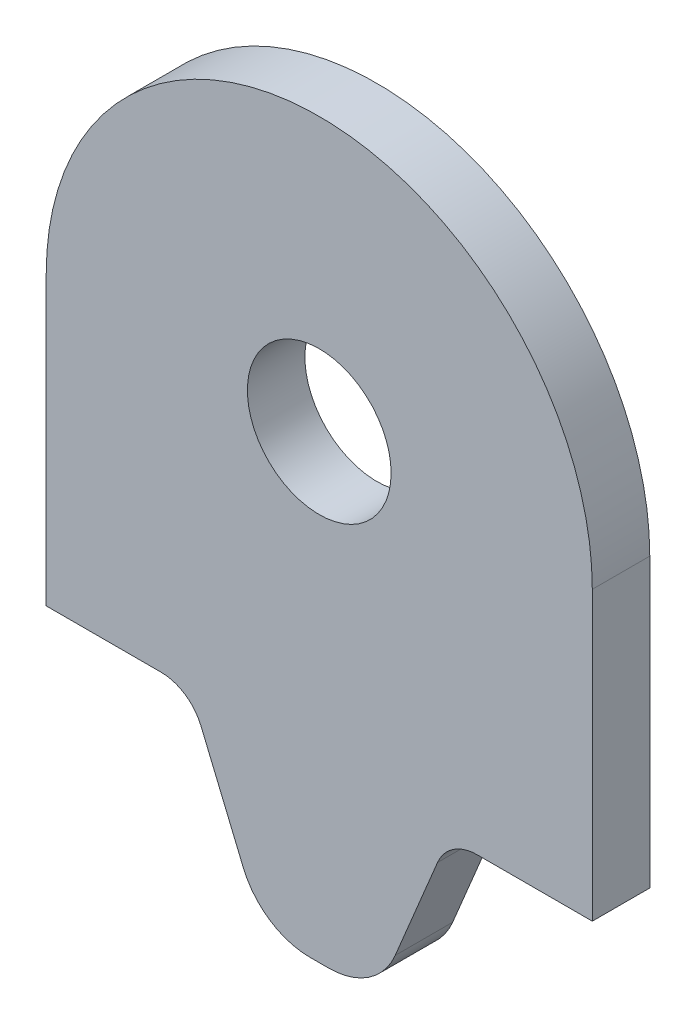
ISO-10303-21;
HEADER;
FILE_DESCRIPTION(('STEP AP214'),'2;1');
FILE_NAME('part.step','',(''),(''),'','','');
FILE_SCHEMA(('AUTOMOTIVE_DESIGN { 1 0 10303 214 1 1 1 1 }'));
ENDSEC;
DATA;
#1=APPLICATION_CONTEXT('core data for automotive mechanical design processes');
#2=APPLICATION_PROTOCOL_DEFINITION('international standard','automotive_design',2000,#1);
#3=PRODUCT_CONTEXT('',#1,'mechanical');
#4=PRODUCT('Part','Part','',(#3));
#5=PRODUCT_RELATED_PRODUCT_CATEGORY('part','',(#4));
#6=PRODUCT_DEFINITION_FORMATION('','',#4);
#7=PRODUCT_DEFINITION_CONTEXT('part definition',#1,'design');
#8=PRODUCT_DEFINITION('design','',#6,#7);
#9=PRODUCT_DEFINITION_SHAPE('','',#8);
#10=(LENGTH_UNIT() NAMED_UNIT(*) SI_UNIT(.MILLI.,.METRE.));
#11=(NAMED_UNIT(*) PLANE_ANGLE_UNIT() SI_UNIT($,.RADIAN.));
#12=(NAMED_UNIT(*) SI_UNIT($,.STERADIAN.) SOLID_ANGLE_UNIT());
#13=UNCERTAINTY_MEASURE_WITH_UNIT(LENGTH_MEASURE(1.E-05),#10,'distance_accuracy_value','');
#14=(GEOMETRIC_REPRESENTATION_CONTEXT(3) GLOBAL_UNCERTAINTY_ASSIGNED_CONTEXT((#13)) GLOBAL_UNIT_ASSIGNED_CONTEXT((#10,
#11,#12)) REPRESENTATION_CONTEXT('',''));
#15=CARTESIAN_POINT('',(0.,0.,0.));
#16=DIRECTION('',(0.,0.,1.));
#17=DIRECTION('',(1.,0.,0.));
#18=AXIS2_PLACEMENT_3D('',#15,#16,#17);
#19=CARTESIAN_POINT('',(0.,0.,4.));
#20=DIRECTION('',(0.,0.,1.));
#21=DIRECTION('',(1.,0.,0.));
#22=AXIS2_PLACEMENT_3D('',#19,#20,#21);
#23=PLANE('',#22);
#24=DIRECTION('',(-0.384615384615385,0.923076923076923,0.));
#25=VECTOR('',#24,1.);
#26=CARTESIAN_POINT('',(-9.,-20.,4.));
#27=LINE('',#26,#25);
#28=CARTESIAN_POINT('',(-5.28205128205128,-28.9230769230769,4.));
#29=VERTEX_POINT('',#28);
#30=CARTESIAN_POINT('',(-8.23076923076923,-21.8461538461538,4.));
#31=VERTEX_POINT('',#30);
#32=EDGE_CURVE('E226',#29,#31,#27,.T.);
#33=ORIENTED_EDGE('',*,*,#32,.F.);
#34=CARTESIAN_POINT('',(-0.666666666666667,-27.,4.));
#35=DIRECTION('',(0.,0.,1.));
#36=DIRECTION('',(1.,0.,0.));
#37=AXIS2_PLACEMENT_3D('',#34,#35,#36);
#38=CIRCLE('',#37,5.);
#39=CARTESIAN_POINT('',(-0.666666666666667,-32.,4.));
#40=VERTEX_POINT('',#39);
#41=EDGE_CURVE('E168',#29,#40,#38,.T.);
#42=ORIENTED_EDGE('',*,*,#41,.T.);
#43=DIRECTION('',(-1.,0.,0.));
#44=VECTOR('',#43,1.);
#45=CARTESIAN_POINT('',(-4.,-32.,4.));
#46=LINE('',#45,#44);
#47=CARTESIAN_POINT('',(0.666666666666685,-32.,4.));
#48=VERTEX_POINT('',#47);
#49=EDGE_CURVE('E220',#48,#40,#46,.T.);
#50=ORIENTED_EDGE('',*,*,#49,.F.);
#51=CARTESIAN_POINT('',(0.666666666666685,-27.,4.));
#52=DIRECTION('',(0.,0.,1.));
#53=DIRECTION('',(1.,0.,0.));
#54=AXIS2_PLACEMENT_3D('',#51,#52,#53);
#55=CIRCLE('',#54,5.);
#56=CARTESIAN_POINT('',(5.2820512820513,-28.9230769230769,4.));
#57=VERTEX_POINT('',#56);
#58=EDGE_CURVE('E165',#48,#57,#55,.T.);
#59=ORIENTED_EDGE('',*,*,#58,.T.);
#60=DIRECTION('',(-0.384615384615384,-0.923076923076923,0.));
#61=VECTOR('',#60,1.);
#62=CARTESIAN_POINT('',(4.00000000000002,-32.,4.));
#63=LINE('',#62,#61);
#64=CARTESIAN_POINT('',(8.23076923076925,-21.8461538461538,4.));
#65=VERTEX_POINT('',#64);
#66=EDGE_CURVE('E215',#65,#57,#63,.T.);
#67=ORIENTED_EDGE('',*,*,#66,.F.);
#68=CARTESIAN_POINT('',(11.,-23.,4.));
#69=DIRECTION('',(0.,0.,1.));
#70=DIRECTION('',(1.,0.,0.));
#71=AXIS2_PLACEMENT_3D('',#68,#69,#70);
#72=CIRCLE('',#71,3.);
#73=CARTESIAN_POINT('',(11.,-20.,4.));
#74=VERTEX_POINT('',#73);
#75=EDGE_CURVE('E190',#65,#74,#72,.F.);
#76=ORIENTED_EDGE('',*,*,#75,.T.);
#77=DIRECTION('',(-1.,0.,0.));
#78=VECTOR('',#77,1.);
#79=CARTESIAN_POINT('',(9.00000000000002,-20.,4.));
#80=LINE('',#79,#78);
#81=CARTESIAN_POINT('',(19.,-20.,4.));
#82=VERTEX_POINT('',#81);
#83=EDGE_CURVE('E213',#82,#74,#80,.T.);
#84=ORIENTED_EDGE('',*,*,#83,.F.);
#85=DIRECTION('',(0.,1.,0.));
#86=VECTOR('',#85,1.);
#87=CARTESIAN_POINT('',(19.,-45.,4.));
#88=LINE('',#87,#86);
#89=CARTESIAN_POINT('',(19.,0.,4.));
#90=VERTEX_POINT('',#89);
#91=EDGE_CURVE('E160',#82,#90,#88,.T.);
#92=ORIENTED_EDGE('',*,*,#91,.T.);
#93=CARTESIAN_POINT('',(0.,0.,4.));
#94=DIRECTION('',(0.,0.,1.));
#95=DIRECTION('',(1.,0.,0.));
#96=AXIS2_PLACEMENT_3D('',#93,#94,#95);
#97=CIRCLE('',#96,19.);
#98=CARTESIAN_POINT('',(-19.,0.,4.));
#99=VERTEX_POINT('',#98);
#100=EDGE_CURVE('E151',#90,#99,#97,.T.);
#101=ORIENTED_EDGE('',*,*,#100,.T.);
#102=DIRECTION('',(0.,-1.,0.));
#103=VECTOR('',#102,1.);
#104=CARTESIAN_POINT('',(-19.,0.,4.));
#105=LINE('',#104,#103);
#106=CARTESIAN_POINT('',(-19.,-20.,4.));
#107=VERTEX_POINT('',#106);
#108=EDGE_CURVE('E236',#99,#107,#105,.T.);
#109=ORIENTED_EDGE('',*,*,#108,.T.);
#110=DIRECTION('',(-1.,0.,0.));
#111=VECTOR('',#110,1.);
#112=CARTESIAN_POINT('',(-19.,-20.,4.));
#113=LINE('',#112,#111);
#114=CARTESIAN_POINT('',(-11.,-20.,4.));
#115=VERTEX_POINT('',#114);
#116=EDGE_CURVE('E139',#115,#107,#113,.T.);
#117=ORIENTED_EDGE('',*,*,#116,.F.);
#118=CARTESIAN_POINT('',(-11.,-23.,4.));
#119=DIRECTION('',(0.,0.,1.));
#120=DIRECTION('',(1.,0.,0.));
#121=AXIS2_PLACEMENT_3D('',#118,#119,#120);
#122=CIRCLE('',#121,3.);
#123=EDGE_CURVE('E41',#115,#31,#122,.F.);
#124=ORIENTED_EDGE('',*,*,#123,.T.);
#125=EDGE_LOOP('',(#33,#42,#50,#59,#67,#76,#84,#92,#101,#109,#117,#124));
#126=FACE_BOUND('',#125,.T.);
#127=CARTESIAN_POINT('',(0.,0.,4.));
#128=DIRECTION('',(0.,0.,1.));
#129=DIRECTION('',(1.,0.,0.));
#130=AXIS2_PLACEMENT_3D('',#127,#128,#129);
#131=CIRCLE('',#130,5.);
#132=CARTESIAN_POINT('',(5.,0.,4.));
#133=VERTEX_POINT('',#132);
#134=EDGE_CURVE('E142',#133,#133,#131,.T.);
#135=ORIENTED_EDGE('',*,*,#134,.F.);
#136=EDGE_LOOP('',(#135));
#137=FACE_BOUND('',#136,.T.);
#138=ADVANCED_FACE('F33',(#126,#137),#23,.T.);
#139=CARTESIAN_POINT('',(0.,0.,0.));
#140=DIRECTION('',(0.,0.,1.));
#141=DIRECTION('',(1.,0.,0.));
#142=AXIS2_PLACEMENT_3D('',#139,#140,#141);
#143=PLANE('',#142);
#144=CARTESIAN_POINT('',(0.,0.,0.));
#145=DIRECTION('',(0.,0.,1.));
#146=DIRECTION('',(1.,0.,0.));
#147=AXIS2_PLACEMENT_3D('',#144,#145,#146);
#148=CIRCLE('',#147,5.);
#149=CARTESIAN_POINT('',(5.,0.,0.));
#150=VERTEX_POINT('',#149);
#151=EDGE_CURVE('E153',#150,#150,#148,.T.);
#152=ORIENTED_EDGE('',*,*,#151,.T.);
#153=EDGE_LOOP('',(#152));
#154=FACE_BOUND('',#153,.T.);
#155=DIRECTION('',(-1.,0.,0.));
#156=VECTOR('',#155,1.);
#157=CARTESIAN_POINT('',(-4.,-32.,0.));
#158=LINE('',#157,#156);
#159=CARTESIAN_POINT('',(0.666666666666685,-32.,0.));
#160=VERTEX_POINT('',#159);
#161=CARTESIAN_POINT('',(-0.666666666666667,-32.,0.));
#162=VERTEX_POINT('',#161);
#163=EDGE_CURVE('E207',#160,#162,#158,.T.);
#164=ORIENTED_EDGE('',*,*,#163,.T.);
#165=CARTESIAN_POINT('',(-0.666666666666667,-27.,0.));
#166=DIRECTION('',(0.,0.,1.));
#167=DIRECTION('',(1.,0.,0.));
#168=AXIS2_PLACEMENT_3D('',#165,#166,#167);
#169=CIRCLE('',#168,5.);
#170=CARTESIAN_POINT('',(-5.28205128205128,-28.9230769230769,0.));
#171=VERTEX_POINT('',#170);
#172=EDGE_CURVE('E177',#162,#171,#169,.F.);
#173=ORIENTED_EDGE('',*,*,#172,.T.);
#174=DIRECTION('',(-0.384615384615385,0.923076923076923,0.));
#175=VECTOR('',#174,1.);
#176=CARTESIAN_POINT('',(-9.,-20.,0.));
#177=LINE('',#176,#175);
#178=CARTESIAN_POINT('',(-8.23076923076923,-21.8461538461538,0.));
#179=VERTEX_POINT('',#178);
#180=EDGE_CURVE('E134',#171,#179,#177,.T.);
#181=ORIENTED_EDGE('',*,*,#180,.T.);
#182=CARTESIAN_POINT('',(-11.,-23.,0.));
#183=DIRECTION('',(0.,0.,1.));
#184=DIRECTION('',(1.,0.,0.));
#185=AXIS2_PLACEMENT_3D('',#182,#183,#184);
#186=CIRCLE('',#185,3.);
#187=CARTESIAN_POINT('',(-11.,-20.,0.));
#188=VERTEX_POINT('',#187);
#189=EDGE_CURVE('E11',#179,#188,#186,.T.);
#190=ORIENTED_EDGE('',*,*,#189,.T.);
#191=DIRECTION('',(-1.,0.,0.));
#192=VECTOR('',#191,1.);
#193=CARTESIAN_POINT('',(-19.,-20.,0.));
#194=LINE('',#193,#192);
#195=CARTESIAN_POINT('',(-19.,-20.,0.));
#196=VERTEX_POINT('',#195);
#197=EDGE_CURVE('E121',#188,#196,#194,.T.);
#198=ORIENTED_EDGE('',*,*,#197,.T.);
#199=DIRECTION('',(0.,-1.,0.));
#200=VECTOR('',#199,1.);
#201=CARTESIAN_POINT('',(-19.,0.,0.));
#202=LINE('',#201,#200);
#203=CARTESIAN_POINT('',(-19.,0.,0.));
#204=VERTEX_POINT('',#203);
#205=EDGE_CURVE('E127',#204,#196,#202,.T.);
#206=ORIENTED_EDGE('',*,*,#205,.F.);
#207=CARTESIAN_POINT('',(0.,0.,0.));
#208=DIRECTION('',(0.,0.,1.));
#209=DIRECTION('',(1.,0.,0.));
#210=AXIS2_PLACEMENT_3D('',#207,#208,#209);
#211=CIRCLE('',#210,19.);
#212=CARTESIAN_POINT('',(19.,0.,0.));
#213=VERTEX_POINT('',#212);
#214=EDGE_CURVE('E149',#213,#204,#211,.T.);
#215=ORIENTED_EDGE('',*,*,#214,.F.);
#216=DIRECTION('',(0.,1.,0.));
#217=VECTOR('',#216,1.);
#218=CARTESIAN_POINT('',(19.,-45.,0.));
#219=LINE('',#218,#217);
#220=CARTESIAN_POINT('',(19.,-20.,0.));
#221=VERTEX_POINT('',#220);
#222=EDGE_CURVE('E148',#221,#213,#219,.T.);
#223=ORIENTED_EDGE('',*,*,#222,.F.);
#224=DIRECTION('',(-1.,0.,0.));
#225=VECTOR('',#224,1.);
#226=CARTESIAN_POINT('',(9.00000000000002,-20.,0.));
#227=LINE('',#226,#225);
#228=CARTESIAN_POINT('',(11.,-20.,0.));
#229=VERTEX_POINT('',#228);
#230=EDGE_CURVE('E198',#221,#229,#227,.T.);
#231=ORIENTED_EDGE('',*,*,#230,.T.);
#232=CARTESIAN_POINT('',(11.,-23.,0.));
#233=DIRECTION('',(0.,0.,1.));
#234=DIRECTION('',(1.,0.,0.));
#235=AXIS2_PLACEMENT_3D('',#232,#233,#234);
#236=CIRCLE('',#235,3.);
#237=CARTESIAN_POINT('',(8.23076923076925,-21.8461538461538,0.));
#238=VERTEX_POINT('',#237);
#239=EDGE_CURVE('E192',#229,#238,#236,.T.);
#240=ORIENTED_EDGE('',*,*,#239,.T.);
#241=DIRECTION('',(-0.384615384615384,-0.923076923076923,0.));
#242=VECTOR('',#241,1.);
#243=CARTESIAN_POINT('',(4.00000000000002,-32.,0.));
#244=LINE('',#243,#242);
#245=CARTESIAN_POINT('',(5.2820512820513,-28.9230769230769,0.));
#246=VERTEX_POINT('',#245);
#247=EDGE_CURVE('E196',#238,#246,#244,.T.);
#248=ORIENTED_EDGE('',*,*,#247,.T.);
#249=CARTESIAN_POINT('',(0.666666666666685,-27.,0.));
#250=DIRECTION('',(0.,0.,1.));
#251=DIRECTION('',(1.,0.,0.));
#252=AXIS2_PLACEMENT_3D('',#249,#250,#251);
#253=CIRCLE('',#252,5.);
#254=EDGE_CURVE('E175',#246,#160,#253,.F.);
#255=ORIENTED_EDGE('',*,*,#254,.T.);
#256=EDGE_LOOP('',(#164,#173,#181,#190,#198,#206,#215,#223,#231,#240,#248,#255));
#257=FACE_BOUND('',#256,.T.);
#258=ADVANCED_FACE('F124',(#154,#257),#143,.F.);
#259=CARTESIAN_POINT('',(0.,0.,4.));
#260=DIRECTION('',(0.,0.,-1.));
#261=DIRECTION('',(-1.,0.,0.));
#262=AXIS2_PLACEMENT_3D('',#259,#260,#261);
#263=CYLINDRICAL_SURFACE('',#262,19.);
#264=ORIENTED_EDGE('',*,*,#214,.T.);
#265=DIRECTION('',(0.,0.,-1.));
#266=VECTOR('',#265,1.);
#267=CARTESIAN_POINT('',(-19.,0.,4.));
#268=LINE('',#267,#266);
#269=EDGE_CURVE('E146',#99,#204,#268,.T.);
#270=ORIENTED_EDGE('',*,*,#269,.F.);
#271=ORIENTED_EDGE('',*,*,#100,.F.);
#272=DIRECTION('',(0.,0.,-1.));
#273=VECTOR('',#272,1.);
#274=CARTESIAN_POINT('',(19.,0.,4.));
#275=LINE('',#274,#273);
#276=EDGE_CURVE('E157',#90,#213,#275,.T.);
#277=ORIENTED_EDGE('',*,*,#276,.T.);
#278=EDGE_LOOP('',(#264,#270,#271,#277));
#279=FACE_BOUND('',#278,.T.);
#280=ADVANCED_FACE('F242',(#279),#263,.T.);
#281=CARTESIAN_POINT('',(-19.,0.,4.));
#282=DIRECTION('',(1.,0.,0.));
#283=DIRECTION('',(0.,1.,0.));
#284=AXIS2_PLACEMENT_3D('',#281,#282,#283);
#285=PLANE('',#284);
#286=ORIENTED_EDGE('',*,*,#205,.T.);
#287=DIRECTION('',(0.,0.,1.));
#288=VECTOR('',#287,1.);
#289=CARTESIAN_POINT('',(-19.,-20.,0.));
#290=LINE('',#289,#288);
#291=EDGE_CURVE('E137',#196,#107,#290,.T.);
#292=ORIENTED_EDGE('',*,*,#291,.T.);
#293=ORIENTED_EDGE('',*,*,#108,.F.);
#294=ORIENTED_EDGE('',*,*,#269,.T.);
#295=EDGE_LOOP('',(#286,#292,#293,#294));
#296=FACE_BOUND('',#295,.T.);
#297=ADVANCED_FACE('F144',(#296),#285,.F.);
#298=CARTESIAN_POINT('',(19.,-45.,4.));
#299=DIRECTION('',(-1.,0.,0.));
#300=DIRECTION('',(0.,0.,1.));
#301=AXIS2_PLACEMENT_3D('',#298,#299,#300);
#302=PLANE('',#301);
#303=ORIENTED_EDGE('',*,*,#91,.F.);
#304=DIRECTION('',(0.,0.,1.));
#305=VECTOR('',#304,1.);
#306=CARTESIAN_POINT('',(19.,-20.,0.));
#307=LINE('',#306,#305);
#308=EDGE_CURVE('E133',#221,#82,#307,.T.);
#309=ORIENTED_EDGE('',*,*,#308,.F.);
#310=ORIENTED_EDGE('',*,*,#222,.T.);
#311=ORIENTED_EDGE('',*,*,#276,.F.);
#312=EDGE_LOOP('',(#303,#309,#310,#311));
#313=FACE_BOUND('',#312,.T.);
#314=ADVANCED_FACE('F240',(#313),#302,.F.);
#315=CARTESIAN_POINT('',(0.,0.,0.));
#316=DIRECTION('',(0.,0.,1.));
#317=DIRECTION('',(1.,0.,0.));
#318=AXIS2_PLACEMENT_3D('',#315,#316,#317);
#319=CYLINDRICAL_SURFACE('',#318,5.);
#320=ORIENTED_EDGE('',*,*,#151,.F.);
#321=EDGE_LOOP('',(#320));
#322=FACE_BOUND('',#321,.T.);
#323=ORIENTED_EDGE('',*,*,#134,.T.);
#324=EDGE_LOOP('',(#323));
#325=FACE_BOUND('',#324,.T.);
#326=ADVANCED_FACE('F258',(#322,#325),#319,.F.);
#327=CARTESIAN_POINT('',(-19.,-20.,0.));
#328=DIRECTION('',(0.,1.,0.));
#329=DIRECTION('',(-1.,0.,0.));
#330=AXIS2_PLACEMENT_3D('',#327,#328,#329);
#331=PLANE('',#330);
#332=ORIENTED_EDGE('',*,*,#197,.F.);
#333=DIRECTION('',(0.,0.,1.));
#334=VECTOR('',#333,1.);
#335=CARTESIAN_POINT('',(-11.,-20.,4.));
#336=LINE('',#335,#334);
#337=EDGE_CURVE('E187',#188,#115,#336,.T.);
#338=ORIENTED_EDGE('',*,*,#337,.T.);
#339=ORIENTED_EDGE('',*,*,#116,.T.);
#340=ORIENTED_EDGE('',*,*,#291,.F.);
#341=EDGE_LOOP('',(#332,#338,#339,#340));
#342=FACE_BOUND('',#341,.T.);
#343=ADVANCED_FACE('F138',(#342),#331,.F.);
#344=CARTESIAN_POINT('',(-9.,-20.,0.));
#345=DIRECTION('',(0.923076923076923,0.384615384615385,0.));
#346=DIRECTION('',(-0.384615384615385,0.923076923076923,0.));
#347=AXIS2_PLACEMENT_3D('',#344,#345,#346);
#348=PLANE('',#347);
#349=ORIENTED_EDGE('',*,*,#32,.T.);
#350=DIRECTION('',(0.,0.,1.));
#351=VECTOR('',#350,1.);
#352=CARTESIAN_POINT('',(-8.23076923076923,-21.8461538461538,0.));
#353=LINE('',#352,#351);
#354=EDGE_CURVE('E54',#31,#179,#353,.F.);
#355=ORIENTED_EDGE('',*,*,#354,.T.);
#356=ORIENTED_EDGE('',*,*,#180,.F.);
#357=DIRECTION('',(0.,0.,1.));
#358=VECTOR('',#357,1.);
#359=CARTESIAN_POINT('',(-5.28205128205128,-28.9230769230769,0.));
#360=LINE('',#359,#358);
#361=EDGE_CURVE('E162',#171,#29,#360,.T.);
#362=ORIENTED_EDGE('',*,*,#361,.T.);
#363=EDGE_LOOP('',(#349,#355,#356,#362));
#364=FACE_BOUND('',#363,.T.);
#365=ADVANCED_FACE('F269',(#364),#348,.F.);
#366=CARTESIAN_POINT('',(-4.,-32.,0.));
#367=DIRECTION('',(0.,1.,0.));
#368=DIRECTION('',(0.,0.,1.));
#369=AXIS2_PLACEMENT_3D('',#366,#367,#368);
#370=PLANE('',#369);
#371=ORIENTED_EDGE('',*,*,#49,.T.);
#372=DIRECTION('',(0.,0.,1.));
#373=VECTOR('',#372,1.);
#374=CARTESIAN_POINT('',(-0.666666666666667,-32.,0.));
#375=LINE('',#374,#373);
#376=EDGE_CURVE('E173',#40,#162,#375,.F.);
#377=ORIENTED_EDGE('',*,*,#376,.T.);
#378=ORIENTED_EDGE('',*,*,#163,.F.);
#379=DIRECTION('',(0.,0.,1.));
#380=VECTOR('',#379,1.);
#381=CARTESIAN_POINT('',(0.666666666666685,-32.,0.));
#382=LINE('',#381,#380);
#383=EDGE_CURVE('E170',#160,#48,#382,.T.);
#384=ORIENTED_EDGE('',*,*,#383,.T.);
#385=EDGE_LOOP('',(#371,#377,#378,#384));
#386=FACE_BOUND('',#385,.T.);
#387=ADVANCED_FACE('F277',(#386),#370,.F.);
#388=CARTESIAN_POINT('',(4.00000000000002,-32.,0.));
#389=DIRECTION('',(-0.923076923076923,0.384615384615384,0.));
#390=DIRECTION('',(-0.384615384615384,-0.923076923076923,0.));
#391=AXIS2_PLACEMENT_3D('',#388,#389,#390);
#392=PLANE('',#391);
#393=ORIENTED_EDGE('',*,*,#247,.F.);
#394=DIRECTION('',(0.,0.,1.));
#395=VECTOR('',#394,1.);
#396=CARTESIAN_POINT('',(8.23076923076925,-21.8461538461538,4.));
#397=LINE('',#396,#395);
#398=EDGE_CURVE('E182',#238,#65,#397,.T.);
#399=ORIENTED_EDGE('',*,*,#398,.T.);
#400=ORIENTED_EDGE('',*,*,#66,.T.);
#401=DIRECTION('',(0.,0.,1.));
#402=VECTOR('',#401,1.);
#403=CARTESIAN_POINT('',(5.2820512820513,-28.9230769230769,0.));
#404=LINE('',#403,#402);
#405=EDGE_CURVE('E179',#57,#246,#404,.F.);
#406=ORIENTED_EDGE('',*,*,#405,.T.);
#407=EDGE_LOOP('',(#393,#399,#400,#406));
#408=FACE_BOUND('',#407,.T.);
#409=ADVANCED_FACE('F203',(#408),#392,.F.);
#410=CARTESIAN_POINT('',(9.00000000000002,-20.,0.));
#411=DIRECTION('',(0.,1.,0.));
#412=DIRECTION('',(-1.,0.,0.));
#413=AXIS2_PLACEMENT_3D('',#410,#411,#412);
#414=PLANE('',#413);
#415=ORIENTED_EDGE('',*,*,#83,.T.);
#416=DIRECTION('',(0.,0.,1.));
#417=VECTOR('',#416,1.);
#418=CARTESIAN_POINT('',(11.,-20.,0.));
#419=LINE('',#418,#417);
#420=EDGE_CURVE('E185',#74,#229,#419,.F.);
#421=ORIENTED_EDGE('',*,*,#420,.T.);
#422=ORIENTED_EDGE('',*,*,#230,.F.);
#423=ORIENTED_EDGE('',*,*,#308,.T.);
#424=EDGE_LOOP('',(#415,#421,#422,#423));
#425=FACE_BOUND('',#424,.T.);
#426=ADVANCED_FACE('F217',(#425),#414,.F.);
#427=CARTESIAN_POINT('',(-0.666666666666667,-27.,0.));
#428=DIRECTION('',(0.,0.,1.));
#429=DIRECTION('',(1.,0.,0.));
#430=AXIS2_PLACEMENT_3D('',#427,#428,#429);
#431=CYLINDRICAL_SURFACE('',#430,5.);
#432=ORIENTED_EDGE('',*,*,#172,.F.);
#433=ORIENTED_EDGE('',*,*,#376,.F.);
#434=ORIENTED_EDGE('',*,*,#41,.F.);
#435=ORIENTED_EDGE('',*,*,#361,.F.);
#436=EDGE_LOOP('',(#432,#433,#434,#435));
#437=FACE_BOUND('',#436,.T.);
#438=ADVANCED_FACE('F285',(#437),#431,.T.);
#439=CARTESIAN_POINT('',(0.666666666666685,-27.,0.));
#440=DIRECTION('',(0.,0.,1.));
#441=DIRECTION('',(1.,0.,0.));
#442=AXIS2_PLACEMENT_3D('',#439,#440,#441);
#443=CYLINDRICAL_SURFACE('',#442,5.);
#444=ORIENTED_EDGE('',*,*,#254,.F.);
#445=ORIENTED_EDGE('',*,*,#405,.F.);
#446=ORIENTED_EDGE('',*,*,#58,.F.);
#447=ORIENTED_EDGE('',*,*,#383,.F.);
#448=EDGE_LOOP('',(#444,#445,#446,#447));
#449=FACE_BOUND('',#448,.T.);
#450=ADVANCED_FACE('F289',(#449),#443,.T.);
#451=CARTESIAN_POINT('',(11.,-23.,0.));
#452=DIRECTION('',(0.,0.,-1.));
#453=DIRECTION('',(-1.,0.,0.));
#454=AXIS2_PLACEMENT_3D('',#451,#452,#453);
#455=CYLINDRICAL_SURFACE('',#454,3.);
#456=ORIENTED_EDGE('',*,*,#239,.F.);
#457=ORIENTED_EDGE('',*,*,#420,.F.);
#458=ORIENTED_EDGE('',*,*,#75,.F.);
#459=ORIENTED_EDGE('',*,*,#398,.F.);
#460=EDGE_LOOP('',(#456,#457,#458,#459));
#461=FACE_BOUND('',#460,.T.);
#462=ADVANCED_FACE('F209',(#461),#455,.F.);
#463=CARTESIAN_POINT('',(-11.,-23.,0.));
#464=DIRECTION('',(0.,0.,-1.));
#465=DIRECTION('',(-1.,0.,0.));
#466=AXIS2_PLACEMENT_3D('',#463,#464,#465);
#467=CYLINDRICAL_SURFACE('',#466,3.);
#468=ORIENTED_EDGE('',*,*,#189,.F.);
#469=ORIENTED_EDGE('',*,*,#354,.F.);
#470=ORIENTED_EDGE('',*,*,#123,.F.);
#471=ORIENTED_EDGE('',*,*,#337,.F.);
#472=EDGE_LOOP('',(#468,#469,#470,#471));
#473=FACE_BOUND('',#472,.T.);
#474=ADVANCED_FACE('F35',(#473),#467,.F.);
#475=CLOSED_SHELL('',(#138,#258,#280,#297,#314,#326,#343,#365,#387,#409,#426,#438,#450,#462,#474));
#476=MANIFOLD_SOLID_BREP('B2',#475);
#477=ADVANCED_BREP_SHAPE_REPRESENTATION('',(#18,#476),#14);
#478=SHAPE_DEFINITION_REPRESENTATION(#9,#477);
ENDSEC;
END-ISO-10303-21;
